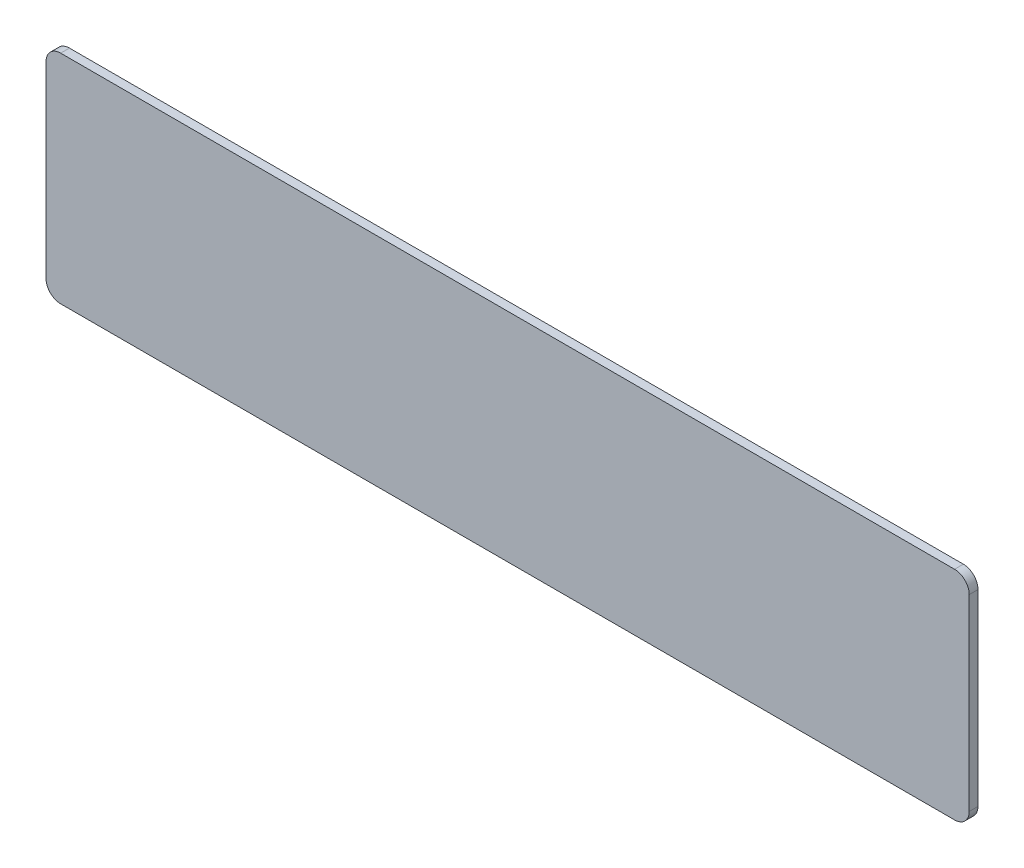
ISO-10303-21;
HEADER;
FILE_DESCRIPTION(('STEP AP214'),'2;1');
FILE_NAME('part.step','',(''),(''),'','','');
FILE_SCHEMA(('AUTOMOTIVE_DESIGN { 1 0 10303 214 1 1 1 1 }'));
ENDSEC;
DATA;
#1=APPLICATION_CONTEXT('core data for automotive mechanical design processes');
#2=APPLICATION_PROTOCOL_DEFINITION('international standard','automotive_design',2000,#1);
#3=PRODUCT_CONTEXT('',#1,'mechanical');
#4=PRODUCT('Part','Part','',(#3));
#5=PRODUCT_RELATED_PRODUCT_CATEGORY('part','',(#4));
#6=PRODUCT_DEFINITION_FORMATION('','',#4);
#7=PRODUCT_DEFINITION_CONTEXT('part definition',#1,'design');
#8=PRODUCT_DEFINITION('design','',#6,#7);
#9=PRODUCT_DEFINITION_SHAPE('','',#8);
#10=(LENGTH_UNIT() NAMED_UNIT(*) SI_UNIT(.MILLI.,.METRE.));
#11=(NAMED_UNIT(*) PLANE_ANGLE_UNIT() SI_UNIT($,.RADIAN.));
#12=(NAMED_UNIT(*) SI_UNIT($,.STERADIAN.) SOLID_ANGLE_UNIT());
#13=UNCERTAINTY_MEASURE_WITH_UNIT(LENGTH_MEASURE(1.E-05),#10,'distance_accuracy_value','');
#14=(GEOMETRIC_REPRESENTATION_CONTEXT(3) GLOBAL_UNCERTAINTY_ASSIGNED_CONTEXT((#13)) GLOBAL_UNIT_ASSIGNED_CONTEXT((#10,
#11,#12)) REPRESENTATION_CONTEXT('',''));
#15=CARTESIAN_POINT('',(0.,0.,0.));
#16=DIRECTION('',(0.,0.,1.));
#17=DIRECTION('',(1.,0.,0.));
#18=AXIS2_PLACEMENT_3D('',#15,#16,#17);
#19=CARTESIAN_POINT('',(-152.550007014429,32.0500108721496,3.));
#20=DIRECTION('',(0.,0.,-1.));
#21=DIRECTION('',(-1.,0.,0.));
#22=AXIS2_PLACEMENT_3D('',#19,#20,#21);
#23=CYLINDRICAL_SURFACE('',#22,5.);
#24=CARTESIAN_POINT('',(-152.550007014429,32.0500108721496,0.));
#25=DIRECTION('',(0.,0.,1.));
#26=DIRECTION('',(1.,0.,0.));
#27=AXIS2_PLACEMENT_3D('',#24,#25,#26);
#28=CIRCLE('',#27,5.);
#29=CARTESIAN_POINT('',(-152.550007014429,37.0500108721496,0.));
#30=VERTEX_POINT('',#29);
#31=CARTESIAN_POINT('',(-157.550007014429,32.0500108721496,0.));
#32=VERTEX_POINT('',#31);
#33=EDGE_CURVE('E143',#30,#32,#28,.T.);
#34=ORIENTED_EDGE('',*,*,#33,.T.);
#35=DIRECTION('',(0.,0.,-1.));
#36=VECTOR('',#35,1.);
#37=CARTESIAN_POINT('',(-157.550007014429,32.0500108721496,3.));
#38=LINE('',#37,#36);
#39=CARTESIAN_POINT('',(-157.550007014429,32.0500108721496,3.));
#40=VERTEX_POINT('',#39);
#41=EDGE_CURVE('E11',#40,#32,#38,.T.);
#42=ORIENTED_EDGE('',*,*,#41,.F.);
#43=CARTESIAN_POINT('',(-152.550007014429,32.0500108721496,3.));
#44=DIRECTION('',(0.,0.,1.));
#45=DIRECTION('',(1.,0.,0.));
#46=AXIS2_PLACEMENT_3D('',#43,#44,#45);
#47=CIRCLE('',#46,5.);
#48=CARTESIAN_POINT('',(-152.550007014429,37.0500108721496,3.));
#49=VERTEX_POINT('',#48);
#50=EDGE_CURVE('E168',#49,#40,#47,.T.);
#51=ORIENTED_EDGE('',*,*,#50,.F.);
#52=DIRECTION('',(0.,0.,-1.));
#53=VECTOR('',#52,1.);
#54=CARTESIAN_POINT('',(-152.550007014429,37.0500108721496,3.));
#55=LINE('',#54,#53);
#56=EDGE_CURVE('E56',#49,#30,#55,.T.);
#57=ORIENTED_EDGE('',*,*,#56,.T.);
#58=EDGE_LOOP('',(#34,#42,#51,#57));
#59=FACE_BOUND('',#58,.T.);
#60=ADVANCED_FACE('F39',(#59),#23,.T.);
#61=CARTESIAN_POINT('',(-157.550007014429,32.0500108721496,3.));
#62=DIRECTION('',(1.,0.,0.));
#63=DIRECTION('',(0.,0.,-1.));
#64=AXIS2_PLACEMENT_3D('',#61,#62,#63);
#65=PLANE('',#64);
#66=DIRECTION('',(0.,-1.,0.));
#67=VECTOR('',#66,1.);
#68=CARTESIAN_POINT('',(-157.550007014429,32.0500108721496,0.));
#69=LINE('',#68,#67);
#70=CARTESIAN_POINT('',(-157.550007014429,-32.0500108721496,0.));
#71=VERTEX_POINT('',#70);
#72=EDGE_CURVE('E146',#32,#71,#69,.T.);
#73=ORIENTED_EDGE('',*,*,#72,.T.);
#74=DIRECTION('',(0.,0.,-1.));
#75=VECTOR('',#74,1.);
#76=CARTESIAN_POINT('',(-157.550007014429,-32.0500108721496,3.));
#77=LINE('',#76,#75);
#78=CARTESIAN_POINT('',(-157.550007014429,-32.0500108721496,3.));
#79=VERTEX_POINT('',#78);
#80=EDGE_CURVE('E48',#79,#71,#77,.T.);
#81=ORIENTED_EDGE('',*,*,#80,.F.);
#82=DIRECTION('',(0.,-1.,0.));
#83=VECTOR('',#82,1.);
#84=CARTESIAN_POINT('',(-157.550007014429,32.0500108721496,3.));
#85=LINE('',#84,#83);
#86=EDGE_CURVE('E95',#40,#79,#85,.T.);
#87=ORIENTED_EDGE('',*,*,#86,.F.);
#88=ORIENTED_EDGE('',*,*,#41,.T.);
#89=EDGE_LOOP('',(#73,#81,#87,#88));
#90=FACE_BOUND('',#89,.T.);
#91=ADVANCED_FACE('F211',(#90),#65,.F.);
#92=CARTESIAN_POINT('',(-152.550007014429,-32.0500108721496,3.));
#93=DIRECTION('',(0.,0.,-1.));
#94=DIRECTION('',(-1.,0.,0.));
#95=AXIS2_PLACEMENT_3D('',#92,#93,#94);
#96=CYLINDRICAL_SURFACE('',#95,5.);
#97=CARTESIAN_POINT('',(-152.550007014429,-32.0500108721496,0.));
#98=DIRECTION('',(0.,0.,1.));
#99=DIRECTION('',(1.,0.,0.));
#100=AXIS2_PLACEMENT_3D('',#97,#98,#99);
#101=CIRCLE('',#100,5.);
#102=CARTESIAN_POINT('',(-152.550007014429,-37.0500108721496,0.));
#103=VERTEX_POINT('',#102);
#104=EDGE_CURVE('E149',#71,#103,#101,.T.);
#105=ORIENTED_EDGE('',*,*,#104,.T.);
#106=DIRECTION('',(0.,0.,-1.));
#107=VECTOR('',#106,1.);
#108=CARTESIAN_POINT('',(-152.550007014429,-37.0500108721496,3.));
#109=LINE('',#108,#107);
#110=CARTESIAN_POINT('',(-152.550007014429,-37.0500108721496,3.));
#111=VERTEX_POINT('',#110);
#112=EDGE_CURVE('E179',#111,#103,#109,.T.);
#113=ORIENTED_EDGE('',*,*,#112,.F.);
#114=CARTESIAN_POINT('',(-152.550007014429,-32.0500108721496,3.));
#115=DIRECTION('',(0.,0.,1.));
#116=DIRECTION('',(1.,0.,0.));
#117=AXIS2_PLACEMENT_3D('',#114,#115,#116);
#118=CIRCLE('',#117,5.);
#119=EDGE_CURVE('E189',#79,#111,#118,.T.);
#120=ORIENTED_EDGE('',*,*,#119,.F.);
#121=ORIENTED_EDGE('',*,*,#80,.T.);
#122=EDGE_LOOP('',(#105,#113,#120,#121));
#123=FACE_BOUND('',#122,.T.);
#124=ADVANCED_FACE('F187',(#123),#96,.T.);
#125=CARTESIAN_POINT('',(-152.550007014429,-37.0500108721496,3.));
#126=DIRECTION('',(0.,1.,0.));
#127=DIRECTION('',(-1.,0.,0.));
#128=AXIS2_PLACEMENT_3D('',#125,#126,#127);
#129=PLANE('',#128);
#130=DIRECTION('',(1.,0.,0.));
#131=VECTOR('',#130,1.);
#132=CARTESIAN_POINT('',(-152.550007014429,-37.0500108721496,0.));
#133=LINE('',#132,#131);
#134=CARTESIAN_POINT('',(152.550007014429,-37.0500108721496,0.));
#135=VERTEX_POINT('',#134);
#136=EDGE_CURVE('E152',#103,#135,#133,.T.);
#137=ORIENTED_EDGE('',*,*,#136,.T.);
#138=DIRECTION('',(0.,0.,-1.));
#139=VECTOR('',#138,1.);
#140=CARTESIAN_POINT('',(152.550007014429,-37.0500108721496,3.));
#141=LINE('',#140,#139);
#142=CARTESIAN_POINT('',(152.550007014429,-37.0500108721496,3.));
#143=VERTEX_POINT('',#142);
#144=EDGE_CURVE('E175',#143,#135,#141,.T.);
#145=ORIENTED_EDGE('',*,*,#144,.F.);
#146=DIRECTION('',(1.,0.,0.));
#147=VECTOR('',#146,1.);
#148=CARTESIAN_POINT('',(-152.550007014429,-37.0500108721496,3.));
#149=LINE('',#148,#147);
#150=EDGE_CURVE('E137',#111,#143,#149,.T.);
#151=ORIENTED_EDGE('',*,*,#150,.F.);
#152=ORIENTED_EDGE('',*,*,#112,.T.);
#153=EDGE_LOOP('',(#137,#145,#151,#152));
#154=FACE_BOUND('',#153,.T.);
#155=ADVANCED_FACE('F196',(#154),#129,.F.);
#156=CARTESIAN_POINT('',(152.550007014429,-32.0500108721496,3.));
#157=DIRECTION('',(0.,0.,-1.));
#158=DIRECTION('',(-1.,0.,0.));
#159=AXIS2_PLACEMENT_3D('',#156,#157,#158);
#160=CYLINDRICAL_SURFACE('',#159,5.);
#161=CARTESIAN_POINT('',(152.550007014429,-32.0500108721496,0.));
#162=DIRECTION('',(0.,0.,1.));
#163=DIRECTION('',(1.,0.,0.));
#164=AXIS2_PLACEMENT_3D('',#161,#162,#163);
#165=CIRCLE('',#164,5.);
#166=CARTESIAN_POINT('',(157.550007014429,-32.0500108721495,0.));
#167=VERTEX_POINT('',#166);
#168=EDGE_CURVE('E155',#135,#167,#165,.T.);
#169=ORIENTED_EDGE('',*,*,#168,.T.);
#170=DIRECTION('',(0.,0.,-1.));
#171=VECTOR('',#170,1.);
#172=CARTESIAN_POINT('',(157.550007014429,-32.0500108721495,3.));
#173=LINE('',#172,#171);
#174=CARTESIAN_POINT('',(157.550007014429,-32.0500108721495,3.));
#175=VERTEX_POINT('',#174);
#176=EDGE_CURVE('E121',#175,#167,#173,.T.);
#177=ORIENTED_EDGE('',*,*,#176,.F.);
#178=CARTESIAN_POINT('',(152.550007014429,-32.0500108721496,3.));
#179=DIRECTION('',(0.,0.,1.));
#180=DIRECTION('',(1.,0.,0.));
#181=AXIS2_PLACEMENT_3D('',#178,#179,#180);
#182=CIRCLE('',#181,5.);
#183=EDGE_CURVE('E132',#143,#175,#182,.T.);
#184=ORIENTED_EDGE('',*,*,#183,.F.);
#185=ORIENTED_EDGE('',*,*,#144,.T.);
#186=EDGE_LOOP('',(#169,#177,#184,#185));
#187=FACE_BOUND('',#186,.T.);
#188=ADVANCED_FACE('F199',(#187),#160,.T.);
#189=CARTESIAN_POINT('',(157.550007014429,32.0500108721496,3.));
#190=DIRECTION('',(1.,0.,0.));
#191=DIRECTION('',(0.,1.,0.));
#192=AXIS2_PLACEMENT_3D('',#189,#190,#191);
#193=PLANE('',#192);
#194=DIRECTION('',(0.,-1.,0.));
#195=VECTOR('',#194,1.);
#196=CARTESIAN_POINT('',(157.550007014429,32.0500108721496,0.));
#197=LINE('',#196,#195);
#198=CARTESIAN_POINT('',(157.550007014429,32.0500108721496,0.));
#199=VERTEX_POINT('',#198);
#200=EDGE_CURVE('E117',#199,#167,#197,.T.);
#201=ORIENTED_EDGE('',*,*,#200,.F.);
#202=DIRECTION('',(0.,0.,-1.));
#203=VECTOR('',#202,1.);
#204=CARTESIAN_POINT('',(157.550007014429,32.0500108721496,3.));
#205=LINE('',#204,#203);
#206=CARTESIAN_POINT('',(157.550007014429,32.0500108721496,3.));
#207=VERTEX_POINT('',#206);
#208=EDGE_CURVE('E111',#207,#199,#205,.T.);
#209=ORIENTED_EDGE('',*,*,#208,.F.);
#210=DIRECTION('',(0.,-1.,0.));
#211=VECTOR('',#210,1.);
#212=CARTESIAN_POINT('',(157.550007014429,32.0500108721496,3.));
#213=LINE('',#212,#211);
#214=EDGE_CURVE('E115',#207,#175,#213,.T.);
#215=ORIENTED_EDGE('',*,*,#214,.T.);
#216=ORIENTED_EDGE('',*,*,#176,.T.);
#217=EDGE_LOOP('',(#201,#209,#215,#216));
#218=FACE_BOUND('',#217,.T.);
#219=ADVANCED_FACE('F113',(#218),#193,.T.);
#220=CARTESIAN_POINT('',(152.550007014429,32.0500108721496,3.));
#221=DIRECTION('',(0.,0.,-1.));
#222=DIRECTION('',(-1.,0.,0.));
#223=AXIS2_PLACEMENT_3D('',#220,#221,#222);
#224=CYLINDRICAL_SURFACE('',#223,5.);
#225=CARTESIAN_POINT('',(152.550007014429,32.0500108721496,0.));
#226=DIRECTION('',(0.,0.,1.));
#227=DIRECTION('',(1.,0.,0.));
#228=AXIS2_PLACEMENT_3D('',#225,#226,#227);
#229=CIRCLE('',#228,5.);
#230=CARTESIAN_POINT('',(152.550007014429,37.0500108721496,0.));
#231=VERTEX_POINT('',#230);
#232=EDGE_CURVE('E161',#199,#231,#229,.T.);
#233=ORIENTED_EDGE('',*,*,#232,.T.);
#234=DIRECTION('',(0.,0.,-1.));
#235=VECTOR('',#234,1.);
#236=CARTESIAN_POINT('',(152.550007014429,37.0500108721496,3.));
#237=LINE('',#236,#235);
#238=CARTESIAN_POINT('',(152.550007014429,37.0500108721496,3.));
#239=VERTEX_POINT('',#238);
#240=EDGE_CURVE('E83',#239,#231,#237,.T.);
#241=ORIENTED_EDGE('',*,*,#240,.F.);
#242=CARTESIAN_POINT('',(152.550007014429,32.0500108721496,3.));
#243=DIRECTION('',(0.,0.,1.));
#244=DIRECTION('',(1.,0.,0.));
#245=AXIS2_PLACEMENT_3D('',#242,#243,#244);
#246=CIRCLE('',#245,5.);
#247=EDGE_CURVE('E123',#207,#239,#246,.T.);
#248=ORIENTED_EDGE('',*,*,#247,.F.);
#249=ORIENTED_EDGE('',*,*,#208,.T.);
#250=EDGE_LOOP('',(#233,#241,#248,#249));
#251=FACE_BOUND('',#250,.T.);
#252=ADVANCED_FACE('F124',(#251),#224,.T.);
#253=CARTESIAN_POINT('',(-152.550007014429,37.0500108721496,3.));
#254=DIRECTION('',(0.,1.,0.));
#255=DIRECTION('',(0.,0.,1.));
#256=AXIS2_PLACEMENT_3D('',#253,#254,#255);
#257=PLANE('',#256);
#258=DIRECTION('',(1.,0.,0.));
#259=VECTOR('',#258,1.);
#260=CARTESIAN_POINT('',(-152.550007014429,37.0500108721496,0.));
#261=LINE('',#260,#259);
#262=EDGE_CURVE('E164',#30,#231,#261,.T.);
#263=ORIENTED_EDGE('',*,*,#262,.F.);
#264=ORIENTED_EDGE('',*,*,#56,.F.);
#265=DIRECTION('',(1.,0.,0.));
#266=VECTOR('',#265,1.);
#267=CARTESIAN_POINT('',(-152.550007014429,37.0500108721496,3.));
#268=LINE('',#267,#266);
#269=EDGE_CURVE('E128',#49,#239,#268,.T.);
#270=ORIENTED_EDGE('',*,*,#269,.T.);
#271=ORIENTED_EDGE('',*,*,#240,.T.);
#272=EDGE_LOOP('',(#263,#264,#270,#271));
#273=FACE_BOUND('',#272,.T.);
#274=ADVANCED_FACE('F200',(#273),#257,.T.);
#275=CARTESIAN_POINT('',(-152.550007014429,32.0500108721496,3.));
#276=DIRECTION('',(0.,0.,1.));
#277=DIRECTION('',(1.,0.,0.));
#278=AXIS2_PLACEMENT_3D('',#275,#276,#277);
#279=PLANE('',#278);
#280=ORIENTED_EDGE('',*,*,#50,.T.);
#281=ORIENTED_EDGE('',*,*,#86,.T.);
#282=ORIENTED_EDGE('',*,*,#119,.T.);
#283=ORIENTED_EDGE('',*,*,#150,.T.);
#284=ORIENTED_EDGE('',*,*,#183,.T.);
#285=ORIENTED_EDGE('',*,*,#214,.F.);
#286=ORIENTED_EDGE('',*,*,#247,.T.);
#287=ORIENTED_EDGE('',*,*,#269,.F.);
#288=EDGE_LOOP('',(#280,#281,#282,#283,#284,#285,#286,#287));
#289=FACE_BOUND('',#288,.T.);
#290=ADVANCED_FACE('F130',(#289),#279,.T.);
#291=CARTESIAN_POINT('',(-152.550007014429,32.0500108721496,0.));
#292=DIRECTION('',(0.,0.,1.));
#293=DIRECTION('',(1.,0.,0.));
#294=AXIS2_PLACEMENT_3D('',#291,#292,#293);
#295=PLANE('',#294);
#296=ORIENTED_EDGE('',*,*,#33,.F.);
#297=ORIENTED_EDGE('',*,*,#262,.T.);
#298=ORIENTED_EDGE('',*,*,#232,.F.);
#299=ORIENTED_EDGE('',*,*,#200,.T.);
#300=ORIENTED_EDGE('',*,*,#168,.F.);
#301=ORIENTED_EDGE('',*,*,#136,.F.);
#302=ORIENTED_EDGE('',*,*,#104,.F.);
#303=ORIENTED_EDGE('',*,*,#72,.F.);
#304=EDGE_LOOP('',(#296,#297,#298,#299,#300,#301,#302,#303));
#305=FACE_BOUND('',#304,.T.);
#306=ADVANCED_FACE('F192',(#305),#295,.F.);
#307=CLOSED_SHELL('',(#60,#91,#124,#155,#188,#219,#252,#274,#290,#306));
#308=MANIFOLD_SOLID_BREP('B2',#307);
#309=ADVANCED_BREP_SHAPE_REPRESENTATION('',(#18,#308),#14);
#310=SHAPE_DEFINITION_REPRESENTATION(#9,#309);
ENDSEC;
END-ISO-10303-21;
